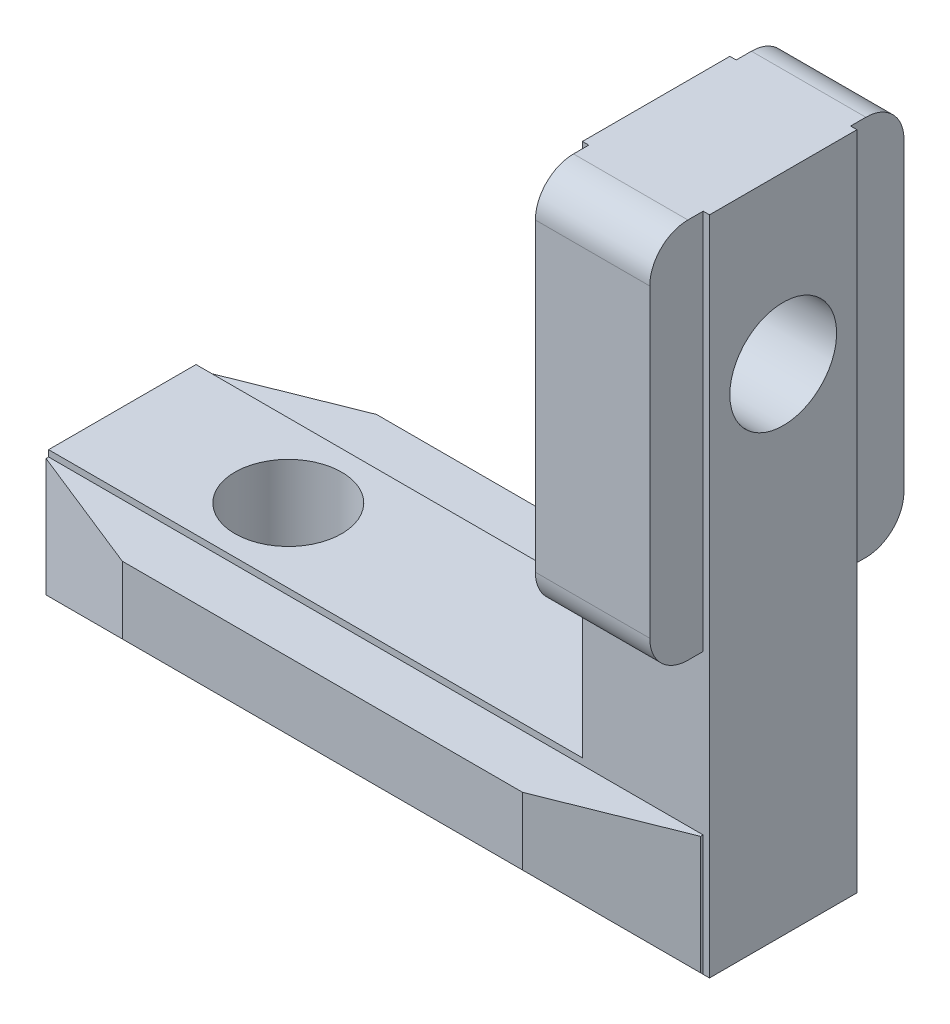
ISO-10303-21;
HEADER;
FILE_DESCRIPTION(('STEP AP214'),'2;1');
FILE_NAME('part.step','',(''),(''),'','','');
FILE_SCHEMA(('AUTOMOTIVE_DESIGN { 1 0 10303 214 1 1 1 1 }'));
ENDSEC;
DATA;
#1=APPLICATION_CONTEXT('core data for automotive mechanical design processes');
#2=APPLICATION_PROTOCOL_DEFINITION('international standard','automotive_design',2000,#1);
#3=PRODUCT_CONTEXT('',#1,'mechanical');
#4=PRODUCT('Part','Part','',(#3));
#5=PRODUCT_RELATED_PRODUCT_CATEGORY('part','',(#4));
#6=PRODUCT_DEFINITION_FORMATION('','',#4);
#7=PRODUCT_DEFINITION_CONTEXT('part definition',#1,'design');
#8=PRODUCT_DEFINITION('design','',#6,#7);
#9=PRODUCT_DEFINITION_SHAPE('','',#8);
#10=(LENGTH_UNIT() NAMED_UNIT(*) SI_UNIT(.MILLI.,.METRE.));
#11=(NAMED_UNIT(*) PLANE_ANGLE_UNIT() SI_UNIT($,.RADIAN.));
#12=(NAMED_UNIT(*) SI_UNIT($,.STERADIAN.) SOLID_ANGLE_UNIT());
#13=UNCERTAINTY_MEASURE_WITH_UNIT(LENGTH_MEASURE(1.E-05),#10,'distance_accuracy_value','');
#14=(GEOMETRIC_REPRESENTATION_CONTEXT(3) GLOBAL_UNCERTAINTY_ASSIGNED_CONTEXT((#13)) GLOBAL_UNIT_ASSIGNED_CONTEXT((#10,
#11,#12)) REPRESENTATION_CONTEXT('',''));
#15=CARTESIAN_POINT('',(0.,0.,0.));
#16=DIRECTION('',(0.,0.,1.));
#17=DIRECTION('',(1.,0.,0.));
#18=AXIS2_PLACEMENT_3D('',#15,#16,#17);
#19=CARTESIAN_POINT('',(-0.250000000000004,4.75,5.));
#20=DIRECTION('',(0.,1.,0.));
#21=DIRECTION('',(0.,0.,1.));
#22=AXIS2_PLACEMENT_3D('',#19,#20,#21);
#23=PLANE('',#22);
#24=DIRECTION('',(-1.,0.,0.));
#25=VECTOR('',#24,1.);
#26=CARTESIAN_POINT('',(-0.250000000000004,4.75,5.));
#27=LINE('',#26,#25);
#28=CARTESIAN_POINT('',(-5.25000000000005,4.75,5.));
#29=VERTEX_POINT('',#28);
#30=CARTESIAN_POINT('',(-21.,4.75,5.));
#31=VERTEX_POINT('',#30);
#32=EDGE_CURVE('E123',#29,#31,#27,.T.);
#33=ORIENTED_EDGE('',*,*,#32,.F.);
#34=DIRECTION('',(0.92847669088526,0.,-0.371390676354101));
#35=VECTOR('',#34,1.);
#36=CARTESIAN_POINT('',(-0.939655172413795,4.75,3.27586206896551));
#37=LINE('',#36,#35);
#38=CARTESIAN_POINT('',(-0.250000000000004,4.75,3.));
#39=VERTEX_POINT('',#38);
#40=EDGE_CURVE('E69',#29,#39,#37,.T.);
#41=ORIENTED_EDGE('',*,*,#40,.T.);
#42=DIRECTION('',(0.,0.,-1.));
#43=VECTOR('',#42,1.);
#44=CARTESIAN_POINT('',(-0.250000000000004,4.75,5.));
#45=LINE('',#44,#43);
#46=CARTESIAN_POINT('',(-0.250000000000004,4.75,2.9));
#47=VERTEX_POINT('',#46);
#48=EDGE_CURVE('E97',#39,#47,#45,.T.);
#49=ORIENTED_EDGE('',*,*,#48,.T.);
#50=DIRECTION('',(-1.,0.,0.));
#51=VECTOR('',#50,1.);
#52=CARTESIAN_POINT('',(-0.250000000000004,4.75,2.9));
#53=LINE('',#52,#51);
#54=CARTESIAN_POINT('',(-26.,4.75,2.9));
#55=VERTEX_POINT('',#54);
#56=EDGE_CURVE('E100',#47,#55,#53,.T.);
#57=ORIENTED_EDGE('',*,*,#56,.T.);
#58=DIRECTION('',(0.,0.,-1.));
#59=VECTOR('',#58,1.);
#60=CARTESIAN_POINT('',(-26.,4.75,5.));
#61=LINE('',#60,#59);
#62=CARTESIAN_POINT('',(-26.,4.75,2.99999999999999));
#63=VERTEX_POINT('',#62);
#64=EDGE_CURVE('E118',#63,#55,#61,.T.);
#65=ORIENTED_EDGE('',*,*,#64,.F.);
#66=DIRECTION('',(-0.928476690885261,0.,-0.371390676354101));
#67=VECTOR('',#66,1.);
#68=CARTESIAN_POINT('',(-3.1120689655172,4.75,12.155172413793));
#69=LINE('',#68,#67);
#70=EDGE_CURVE('E131',#63,#31,#69,.F.);
#71=ORIENTED_EDGE('',*,*,#70,.T.);
#72=EDGE_LOOP('',(#33,#41,#49,#57,#65,#71));
#73=FACE_BOUND('',#72,.T.);
#74=ADVANCED_FACE('F47',(#73),#23,.T.);
#75=CARTESIAN_POINT('',(-0.250000000000004,2.10000000000002,5.));
#76=DIRECTION('',(0.,0.,1.));
#77=DIRECTION('',(1.,0.,0.));
#78=AXIS2_PLACEMENT_3D('',#75,#76,#77);
#79=PLANE('',#78);
#80=DIRECTION('',(-1.,0.,0.));
#81=VECTOR('',#80,1.);
#82=CARTESIAN_POINT('',(-0.250000000000004,2.10000000000002,5.));
#83=LINE('',#82,#81);
#84=CARTESIAN_POINT('',(-5.25000000000005,2.10000000000002,5.));
#85=VERTEX_POINT('',#84);
#86=CARTESIAN_POINT('',(-21.,2.10000000000002,5.));
#87=VERTEX_POINT('',#86);
#88=EDGE_CURVE('E126',#85,#87,#83,.T.);
#89=ORIENTED_EDGE('',*,*,#88,.F.);
#90=DIRECTION('',(0.,1.,0.));
#91=VECTOR('',#90,1.);
#92=CARTESIAN_POINT('',(-5.25000000000005,4.75,5.));
#93=LINE('',#92,#91);
#94=EDGE_CURVE('E139',#85,#29,#93,.T.);
#95=ORIENTED_EDGE('',*,*,#94,.T.);
#96=ORIENTED_EDGE('',*,*,#32,.T.);
#97=DIRECTION('',(0.,-1.,0.));
#98=VECTOR('',#97,1.);
#99=CARTESIAN_POINT('',(-21.,2.10000000000002,5.));
#100=LINE('',#99,#98);
#101=EDGE_CURVE('E134',#31,#87,#100,.T.);
#102=ORIENTED_EDGE('',*,*,#101,.T.);
#103=EDGE_LOOP('',(#89,#95,#96,#102));
#104=FACE_BOUND('',#103,.T.);
#105=ADVANCED_FACE('F145',(#104),#79,.T.);
#106=CARTESIAN_POINT('',(-0.250000000000004,0.,2.9));
#107=DIRECTION('',(0.,-0.707106781186544,0.707106781186551));
#108=DIRECTION('',(0.,-0.707106781186551,-0.707106781186544));
#109=AXIS2_PLACEMENT_3D('',#106,#107,#108);
#110=PLANE('',#109);
#111=DIRECTION('',(0.,0.707106781186551,0.707106781186544));
#112=VECTOR('',#111,1.);
#113=CARTESIAN_POINT('',(-0.250000000000004,0.,2.9));
#114=LINE('',#113,#112);
#115=CARTESIAN_POINT('',(-0.250000000000004,0.,2.9));
#116=VERTEX_POINT('',#115);
#117=CARTESIAN_POINT('',(-0.250000000000004,0.0999999999999982,3.));
#118=VERTEX_POINT('',#117);
#119=EDGE_CURVE('E112',#116,#118,#114,.T.);
#120=ORIENTED_EDGE('',*,*,#119,.T.);
#121=DIRECTION('',(-0.87038827977849,0.348155311911397,0.348155311911393));
#122=VECTOR('',#121,1.);
#123=CARTESIAN_POINT('',(-0.189393939393945,0.0757575757575744,2.97575757575757));
#124=LINE('',#123,#122);
#125=EDGE_CURVE('E12',#118,#85,#124,.T.);
#126=ORIENTED_EDGE('',*,*,#125,.T.);
#127=ORIENTED_EDGE('',*,*,#88,.T.);
#128=DIRECTION('',(0.87038827977849,0.348155311911397,0.348155311911393));
#129=VECTOR('',#128,1.);
#130=CARTESIAN_POINT('',(-6.55303030303028,7.87878787878791,10.7787878787878));
#131=LINE('',#130,#129);
#132=CARTESIAN_POINT('',(-26.,0.0999999999999999,3.));
#133=VERTEX_POINT('',#132);
#134=EDGE_CURVE('E137',#87,#133,#131,.F.);
#135=ORIENTED_EDGE('',*,*,#134,.T.);
#136=DIRECTION('',(0.,0.707106781186551,0.707106781186544));
#137=VECTOR('',#136,1.);
#138=CARTESIAN_POINT('',(-26.,0.,2.9));
#139=LINE('',#138,#137);
#140=CARTESIAN_POINT('',(-26.,0.,2.9));
#141=VERTEX_POINT('',#140);
#142=EDGE_CURVE('E104',#141,#133,#139,.T.);
#143=ORIENTED_EDGE('',*,*,#142,.F.);
#144=DIRECTION('',(-1.,0.,0.));
#145=VECTOR('',#144,1.);
#146=CARTESIAN_POINT('',(-0.250000000000004,0.,2.9));
#147=LINE('',#146,#145);
#148=EDGE_CURVE('E111',#116,#141,#147,.T.);
#149=ORIENTED_EDGE('',*,*,#148,.F.);
#150=EDGE_LOOP('',(#120,#126,#127,#135,#143,#149));
#151=FACE_BOUND('',#150,.T.);
#152=ADVANCED_FACE('F155',(#151),#110,.T.);
#153=CARTESIAN_POINT('',(-0.250000000000004,4.75,2.9));
#154=DIRECTION('',(0.,0.,-1.));
#155=DIRECTION('',(0.,1.,0.));
#156=AXIS2_PLACEMENT_3D('',#153,#154,#155);
#157=PLANE('',#156);
#158=DIRECTION('',(0.,-1.,0.));
#159=VECTOR('',#158,1.);
#160=CARTESIAN_POINT('',(-26.,4.75,2.9));
#161=LINE('',#160,#159);
#162=EDGE_CURVE('E110',#55,#141,#161,.T.);
#163=ORIENTED_EDGE('',*,*,#162,.F.);
#164=ORIENTED_EDGE('',*,*,#56,.F.);
#165=DIRECTION('',(0.,-1.,0.));
#166=VECTOR('',#165,1.);
#167=CARTESIAN_POINT('',(-0.250000000000004,4.75,2.9));
#168=LINE('',#167,#166);
#169=EDGE_CURVE('E103',#47,#116,#168,.T.);
#170=ORIENTED_EDGE('',*,*,#169,.T.);
#171=ORIENTED_EDGE('',*,*,#148,.T.);
#172=EDGE_LOOP('',(#163,#164,#170,#171));
#173=FACE_BOUND('',#172,.T.);
#174=ADVANCED_FACE('F108',(#173),#157,.T.);
#175=CARTESIAN_POINT('',(-0.250000000000004,0.,0.));
#176=DIRECTION('',(-1.,0.,0.));
#177=DIRECTION('',(0.,0.,1.));
#178=AXIS2_PLACEMENT_3D('',#175,#176,#177);
#179=PLANE('',#178);
#180=ORIENTED_EDGE('',*,*,#48,.F.);
#181=DIRECTION('',(0.,-1.,0.));
#182=VECTOR('',#181,1.);
#183=CARTESIAN_POINT('',(-0.250000000000004,2.10000000000002,3.));
#184=LINE('',#183,#182);
#185=EDGE_CURVE('E55',#39,#118,#184,.T.);
#186=ORIENTED_EDGE('',*,*,#185,.T.);
#187=ORIENTED_EDGE('',*,*,#119,.F.);
#188=ORIENTED_EDGE('',*,*,#169,.F.);
#189=EDGE_LOOP('',(#180,#186,#187,#188));
#190=FACE_BOUND('',#189,.T.);
#191=ADVANCED_FACE('F114',(#190),#179,.F.);
#192=CARTESIAN_POINT('',(-26.,0.,0.));
#193=DIRECTION('',(-1.,0.,0.));
#194=DIRECTION('',(0.,0.,1.));
#195=AXIS2_PLACEMENT_3D('',#192,#193,#194);
#196=PLANE('',#195);
#197=ORIENTED_EDGE('',*,*,#142,.T.);
#198=DIRECTION('',(0.,1.,0.));
#199=VECTOR('',#198,1.);
#200=CARTESIAN_POINT('',(-26.,0.,3.));
#201=LINE('',#200,#199);
#202=EDGE_CURVE('E125',#133,#63,#201,.T.);
#203=ORIENTED_EDGE('',*,*,#202,.T.);
#204=ORIENTED_EDGE('',*,*,#64,.T.);
#205=ORIENTED_EDGE('',*,*,#162,.T.);
#206=EDGE_LOOP('',(#197,#203,#204,#205));
#207=FACE_BOUND('',#206,.T.);
#208=ADVANCED_FACE('F157',(#207),#196,.T.);
#209=CARTESIAN_POINT('',(-26.,0.,3.));
#210=DIRECTION('',(0.371390676354101,0.,-0.92847669088526));
#211=DIRECTION('',(0.,1.,0.));
#212=AXIS2_PLACEMENT_3D('',#209,#210,#211);
#213=PLANE('',#212);
#214=ORIENTED_EDGE('',*,*,#134,.F.);
#215=ORIENTED_EDGE('',*,*,#101,.F.);
#216=ORIENTED_EDGE('',*,*,#70,.F.);
#217=ORIENTED_EDGE('',*,*,#202,.F.);
#218=EDGE_LOOP('',(#214,#215,#216,#217));
#219=FACE_BOUND('',#218,.T.);
#220=ADVANCED_FACE('F152',(#219),#213,.F.);
#221=CARTESIAN_POINT('',(-5.25000000000005,2.10000000000002,5.));
#222=DIRECTION('',(0.371390676354101,0.,0.92847669088526));
#223=DIRECTION('',(0.,-1.,0.));
#224=AXIS2_PLACEMENT_3D('',#221,#222,#223);
#225=PLANE('',#224);
#226=ORIENTED_EDGE('',*,*,#125,.F.);
#227=ORIENTED_EDGE('',*,*,#185,.F.);
#228=ORIENTED_EDGE('',*,*,#40,.F.);
#229=ORIENTED_EDGE('',*,*,#94,.F.);
#230=EDGE_LOOP('',(#226,#227,#228,#229));
#231=FACE_BOUND('',#230,.T.);
#232=ADVANCED_FACE('F49',(#231),#225,.T.);
#233=CLOSED_SHELL('',(#74,#105,#152,#174,#191,#208,#220,#232));
#234=MANIFOLD_SOLID_BREP('B2',#233);
#235=CARTESIAN_POINT('',(-0.250000000000004,4.75,-2.9));
#236=DIRECTION('',(0.,0.,1.));
#237=DIRECTION('',(0.,-1.,0.));
#238=AXIS2_PLACEMENT_3D('',#235,#236,#237);
#239=PLANE('',#238);
#240=DIRECTION('',(0.,1.,0.));
#241=VECTOR('',#240,1.);
#242=CARTESIAN_POINT('',(-26.,4.75,-2.9));
#243=LINE('',#242,#241);
#244=CARTESIAN_POINT('',(-26.,0.,-2.9));
#245=VERTEX_POINT('',#244);
#246=CARTESIAN_POINT('',(-26.,4.75,-2.9));
#247=VERTEX_POINT('',#246);
#248=EDGE_CURVE('E307',#245,#247,#243,.T.);
#249=ORIENTED_EDGE('',*,*,#248,.F.);
#250=DIRECTION('',(-1.,0.,0.));
#251=VECTOR('',#250,1.);
#252=CARTESIAN_POINT('',(-0.250000000000004,0.,-2.9));
#253=LINE('',#252,#251);
#254=CARTESIAN_POINT('',(-0.250000000000004,0.,-2.9));
#255=VERTEX_POINT('',#254);
#256=EDGE_CURVE('E301',#255,#245,#253,.T.);
#257=ORIENTED_EDGE('',*,*,#256,.F.);
#258=DIRECTION('',(0.,1.,0.));
#259=VECTOR('',#258,1.);
#260=CARTESIAN_POINT('',(-0.250000000000004,4.75,-2.9));
#261=LINE('',#260,#259);
#262=CARTESIAN_POINT('',(-0.250000000000004,4.75,-2.9));
#263=VERTEX_POINT('',#262);
#264=EDGE_CURVE('E297',#255,#263,#261,.T.);
#265=ORIENTED_EDGE('',*,*,#264,.T.);
#266=DIRECTION('',(-1.,0.,0.));
#267=VECTOR('',#266,1.);
#268=CARTESIAN_POINT('',(-0.250000000000004,4.75,-2.9));
#269=LINE('',#268,#267);
#270=EDGE_CURVE('E282',#263,#247,#269,.T.);
#271=ORIENTED_EDGE('',*,*,#270,.T.);
#272=EDGE_LOOP('',(#249,#257,#265,#271));
#273=FACE_BOUND('',#272,.T.);
#274=ADVANCED_FACE('F231',(#273),#239,.T.);
#275=CARTESIAN_POINT('',(-0.250000000000004,0.,-2.9));
#276=DIRECTION('',(0.,-0.707106781186544,-0.707106781186551));
#277=DIRECTION('',(0.,0.707106781186551,-0.707106781186544));
#278=AXIS2_PLACEMENT_3D('',#275,#276,#277);
#279=PLANE('',#278);
#280=DIRECTION('',(-1.,0.,0.));
#281=VECTOR('',#280,1.);
#282=CARTESIAN_POINT('',(-0.250000000000004,2.10000000000002,-5.));
#283=LINE('',#282,#281);
#284=CARTESIAN_POINT('',(-5.25000000000005,2.10000000000002,-5.));
#285=VERTEX_POINT('',#284);
#286=CARTESIAN_POINT('',(-21.,2.10000000000002,-5.));
#287=VERTEX_POINT('',#286);
#288=EDGE_CURVE('E312',#285,#287,#283,.T.);
#289=ORIENTED_EDGE('',*,*,#288,.F.);
#290=DIRECTION('',(0.87038827977849,-0.348155311911397,0.348155311911393));
#291=VECTOR('',#290,1.);
#292=CARTESIAN_POINT('',(-0.189393939393945,0.0757575757575744,-2.97575757575757));
#293=LINE('',#292,#291);
#294=CARTESIAN_POINT('',(-0.250000000000004,0.0999999999999983,-3.));
#295=VERTEX_POINT('',#294);
#296=EDGE_CURVE('E253',#285,#295,#293,.T.);
#297=ORIENTED_EDGE('',*,*,#296,.T.);
#298=DIRECTION('',(0.,-0.707106781186551,0.707106781186544));
#299=VECTOR('',#298,1.);
#300=CARTESIAN_POINT('',(-0.250000000000004,0.,-2.9));
#301=LINE('',#300,#299);
#302=EDGE_CURVE('E293',#295,#255,#301,.T.);
#303=ORIENTED_EDGE('',*,*,#302,.T.);
#304=ORIENTED_EDGE('',*,*,#256,.T.);
#305=DIRECTION('',(0.,-0.707106781186551,0.707106781186544));
#306=VECTOR('',#305,1.);
#307=CARTESIAN_POINT('',(-26.,0.,-2.9));
#308=LINE('',#307,#306);
#309=CARTESIAN_POINT('',(-26.,0.0999999999999999,-3.));
#310=VERTEX_POINT('',#309);
#311=EDGE_CURVE('E302',#310,#245,#308,.T.);
#312=ORIENTED_EDGE('',*,*,#311,.F.);
#313=DIRECTION('',(-0.87038827977849,-0.348155311911397,0.348155311911393));
#314=VECTOR('',#313,1.);
#315=CARTESIAN_POINT('',(-6.55303030303028,7.87878787878791,-10.7787878787878));
#316=LINE('',#315,#314);
#317=EDGE_CURVE('E317',#310,#287,#316,.F.);
#318=ORIENTED_EDGE('',*,*,#317,.T.);
#319=EDGE_LOOP('',(#289,#297,#303,#304,#312,#318));
#320=FACE_BOUND('',#319,.T.);
#321=ADVANCED_FACE('F333',(#320),#279,.T.);
#322=CARTESIAN_POINT('',(-0.250000000000004,2.10000000000002,-5.));
#323=DIRECTION('',(0.,0.,-1.));
#324=DIRECTION('',(-1.,0.,0.));
#325=AXIS2_PLACEMENT_3D('',#322,#323,#324);
#326=PLANE('',#325);
#327=DIRECTION('',(-1.,0.,0.));
#328=VECTOR('',#327,1.);
#329=CARTESIAN_POINT('',(-0.250000000000004,4.75,-5.));
#330=LINE('',#329,#328);
#331=CARTESIAN_POINT('',(-5.25000000000005,4.75,-5.));
#332=VERTEX_POINT('',#331);
#333=CARTESIAN_POINT('',(-20.9999999999999,4.75,-5.));
#334=VERTEX_POINT('',#333);
#335=EDGE_CURVE('E292',#332,#334,#330,.T.);
#336=ORIENTED_EDGE('',*,*,#335,.F.);
#337=DIRECTION('',(0.,-1.,0.));
#338=VECTOR('',#337,1.);
#339=CARTESIAN_POINT('',(-5.25000000000005,2.10000000000002,-5.));
#340=LINE('',#339,#338);
#341=EDGE_CURVE('E325',#332,#285,#340,.T.);
#342=ORIENTED_EDGE('',*,*,#341,.T.);
#343=ORIENTED_EDGE('',*,*,#288,.T.);
#344=DIRECTION('',(0.,1.,0.));
#345=VECTOR('',#344,1.);
#346=CARTESIAN_POINT('',(-21.,2.10000000000002,-5.));
#347=LINE('',#346,#345);
#348=EDGE_CURVE('E320',#287,#334,#347,.T.);
#349=ORIENTED_EDGE('',*,*,#348,.T.);
#350=EDGE_LOOP('',(#336,#342,#343,#349));
#351=FACE_BOUND('',#350,.T.);
#352=ADVANCED_FACE('F331',(#351),#326,.T.);
#353=CARTESIAN_POINT('',(-0.250000000000004,4.75,-5.));
#354=DIRECTION('',(0.,1.,0.));
#355=DIRECTION('',(0.,0.,1.));
#356=AXIS2_PLACEMENT_3D('',#353,#354,#355);
#357=PLANE('',#356);
#358=DIRECTION('',(0.,0.,-1.));
#359=VECTOR('',#358,1.);
#360=CARTESIAN_POINT('',(-0.250000000000004,4.75,-5.));
#361=LINE('',#360,#359);
#362=CARTESIAN_POINT('',(-0.250000000000004,4.75,-3.));
#363=VERTEX_POINT('',#362);
#364=EDGE_CURVE('E284',#263,#363,#361,.T.);
#365=ORIENTED_EDGE('',*,*,#364,.T.);
#366=DIRECTION('',(-0.92847669088526,0.,-0.371390676354101));
#367=VECTOR('',#366,1.);
#368=CARTESIAN_POINT('',(-0.939655172413795,4.75,-3.27586206896551));
#369=LINE('',#368,#367);
#370=EDGE_CURVE('E45',#363,#332,#369,.T.);
#371=ORIENTED_EDGE('',*,*,#370,.T.);
#372=ORIENTED_EDGE('',*,*,#335,.T.);
#373=DIRECTION('',(0.928476690885261,0.,-0.371390676354101));
#374=VECTOR('',#373,1.);
#375=CARTESIAN_POINT('',(-3.1120689655172,4.75,-12.155172413793));
#376=LINE('',#375,#374);
#377=CARTESIAN_POINT('',(-26.,4.75,-2.99999999999999));
#378=VERTEX_POINT('',#377);
#379=EDGE_CURVE('E323',#334,#378,#376,.F.);
#380=ORIENTED_EDGE('',*,*,#379,.T.);
#381=DIRECTION('',(0.,0.,-1.));
#382=VECTOR('',#381,1.);
#383=CARTESIAN_POINT('',(-26.,4.75,-5.));
#384=LINE('',#383,#382);
#385=EDGE_CURVE('E287',#247,#378,#384,.T.);
#386=ORIENTED_EDGE('',*,*,#385,.F.);
#387=ORIENTED_EDGE('',*,*,#270,.F.);
#388=EDGE_LOOP('',(#365,#371,#372,#380,#386,#387));
#389=FACE_BOUND('',#388,.T.);
#390=ADVANCED_FACE('F283',(#389),#357,.T.);
#391=CARTESIAN_POINT('',(-0.250000000000004,0.,0.));
#392=DIRECTION('',(-1.,0.,0.));
#393=DIRECTION('',(0.,0.,1.));
#394=AXIS2_PLACEMENT_3D('',#391,#392,#393);
#395=PLANE('',#394);
#396=ORIENTED_EDGE('',*,*,#302,.F.);
#397=DIRECTION('',(0.,1.,0.));
#398=VECTOR('',#397,1.);
#399=CARTESIAN_POINT('',(-0.250000000000004,4.75,-3.));
#400=LINE('',#399,#398);
#401=EDGE_CURVE('E239',#295,#363,#400,.T.);
#402=ORIENTED_EDGE('',*,*,#401,.T.);
#403=ORIENTED_EDGE('',*,*,#364,.F.);
#404=ORIENTED_EDGE('',*,*,#264,.F.);
#405=EDGE_LOOP('',(#396,#402,#403,#404));
#406=FACE_BOUND('',#405,.T.);
#407=ADVANCED_FACE('F296',(#406),#395,.F.);
#408=CARTESIAN_POINT('',(-26.,0.,0.));
#409=DIRECTION('',(-1.,0.,0.));
#410=DIRECTION('',(0.,0.,1.));
#411=AXIS2_PLACEMENT_3D('',#408,#409,#410);
#412=PLANE('',#411);
#413=ORIENTED_EDGE('',*,*,#385,.T.);
#414=DIRECTION('',(0.,-1.,0.));
#415=VECTOR('',#414,1.);
#416=CARTESIAN_POINT('',(-26.,0.,-3.));
#417=LINE('',#416,#415);
#418=EDGE_CURVE('E311',#378,#310,#417,.T.);
#419=ORIENTED_EDGE('',*,*,#418,.T.);
#420=ORIENTED_EDGE('',*,*,#311,.T.);
#421=ORIENTED_EDGE('',*,*,#248,.T.);
#422=EDGE_LOOP('',(#413,#419,#420,#421));
#423=FACE_BOUND('',#422,.T.);
#424=ADVANCED_FACE('F341',(#423),#412,.T.);
#425=CARTESIAN_POINT('',(-26.,0.,-3.));
#426=DIRECTION('',(0.371390676354101,0.,0.92847669088526));
#427=DIRECTION('',(0.,-1.,0.));
#428=AXIS2_PLACEMENT_3D('',#425,#426,#427);
#429=PLANE('',#428);
#430=ORIENTED_EDGE('',*,*,#379,.F.);
#431=ORIENTED_EDGE('',*,*,#348,.F.);
#432=ORIENTED_EDGE('',*,*,#317,.F.);
#433=ORIENTED_EDGE('',*,*,#418,.F.);
#434=EDGE_LOOP('',(#430,#431,#432,#433));
#435=FACE_BOUND('',#434,.T.);
#436=ADVANCED_FACE('F339',(#435),#429,.F.);
#437=CARTESIAN_POINT('',(-5.25000000000005,2.10000000000002,-5.));
#438=DIRECTION('',(0.371390676354101,0.,-0.92847669088526));
#439=DIRECTION('',(0.,1.,0.));
#440=AXIS2_PLACEMENT_3D('',#437,#438,#439);
#441=PLANE('',#440);
#442=ORIENTED_EDGE('',*,*,#370,.F.);
#443=ORIENTED_EDGE('',*,*,#401,.F.);
#444=ORIENTED_EDGE('',*,*,#296,.F.);
#445=ORIENTED_EDGE('',*,*,#341,.F.);
#446=EDGE_LOOP('',(#442,#443,#444,#445));
#447=FACE_BOUND('',#446,.T.);
#448=ADVANCED_FACE('F233',(#447),#441,.T.);
#449=CLOSED_SHELL('',(#274,#321,#352,#390,#407,#424,#436,#448));
#450=MANIFOLD_SOLID_BREP('B6',#449);
#451=CARTESIAN_POINT('',(0.,0.,2.9));
#452=DIRECTION('',(0.,0.,1.));
#453=DIRECTION('',(1.,0.,0.));
#454=AXIS2_PLACEMENT_3D('',#451,#452,#453);
#455=PLANE('',#454);
#456=DIRECTION('',(-1.,0.,0.));
#457=VECTOR('',#456,1.);
#458=CARTESIAN_POINT('',(-5.,26.,2.9));
#459=LINE('',#458,#457);
#460=CARTESIAN_POINT('',(0.,26.,2.9));
#461=VERTEX_POINT('',#460);
#462=CARTESIAN_POINT('',(-0.25,26.,2.9));
#463=VERTEX_POINT('',#462);
#464=EDGE_CURVE('E585',#461,#463,#459,.T.);
#465=ORIENTED_EDGE('',*,*,#464,.T.);
#466=DIRECTION('',(0.,-1.,0.));
#467=VECTOR('',#466,1.);
#468=CARTESIAN_POINT('',(-0.25,26.,2.9));
#469=LINE('',#468,#467);
#470=CARTESIAN_POINT('',(-0.25,11.,2.9));
#471=VERTEX_POINT('',#470);
#472=EDGE_CURVE('E411',#463,#471,#469,.T.);
#473=ORIENTED_EDGE('',*,*,#472,.T.);
#474=DIRECTION('',(1.,0.,0.));
#475=VECTOR('',#474,1.);
#476=CARTESIAN_POINT('',(-4.75,11.,2.9));
#477=LINE('',#476,#475);
#478=CARTESIAN_POINT('',(-4.75,11.,2.9));
#479=VERTEX_POINT('',#478);
#480=EDGE_CURVE('E722',#479,#471,#477,.T.);
#481=ORIENTED_EDGE('',*,*,#480,.F.);
#482=DIRECTION('',(0.,-1.,0.));
#483=VECTOR('',#482,1.);
#484=CARTESIAN_POINT('',(-4.75,26.,2.9));
#485=LINE('',#484,#483);
#486=CARTESIAN_POINT('',(-4.75,26.,2.9));
#487=VERTEX_POINT('',#486);
#488=EDGE_CURVE('E430',#487,#479,#485,.T.);
#489=ORIENTED_EDGE('',*,*,#488,.F.);
#490=CARTESIAN_POINT('',(-5.,26.,2.9));
#491=VERTEX_POINT('',#490);
#492=EDGE_CURVE('E589',#487,#491,#459,.T.);
#493=ORIENTED_EDGE('',*,*,#492,.T.);
#494=DIRECTION('',(0.,-1.,0.));
#495=VECTOR('',#494,1.);
#496=CARTESIAN_POINT('',(-5.,5.,2.9));
#497=LINE('',#496,#495);
#498=CARTESIAN_POINT('',(-5.,5.,2.9));
#499=VERTEX_POINT('',#498);
#500=EDGE_CURVE('E588',#491,#499,#497,.T.);
#501=ORIENTED_EDGE('',*,*,#500,.T.);
#502=DIRECTION('',(-1.,0.,0.));
#503=VECTOR('',#502,1.);
#504=CARTESIAN_POINT('',(-26.,5.,2.9));
#505=LINE('',#504,#503);
#506=CARTESIAN_POINT('',(-26.,5.,2.9));
#507=VERTEX_POINT('',#506);
#508=EDGE_CURVE('E598',#499,#507,#505,.T.);
#509=ORIENTED_EDGE('',*,*,#508,.T.);
#510=DIRECTION('',(0.,-1.,0.));
#511=VECTOR('',#510,1.);
#512=CARTESIAN_POINT('',(-26.,5.,2.9));
#513=LINE('',#512,#511);
#514=CARTESIAN_POINT('',(-26.,0.,2.9));
#515=VERTEX_POINT('',#514);
#516=EDGE_CURVE('E634',#507,#515,#513,.T.);
#517=ORIENTED_EDGE('',*,*,#516,.T.);
#518=DIRECTION('',(1.,0.,0.));
#519=VECTOR('',#518,1.);
#520=CARTESIAN_POINT('',(-26.,0.,2.9));
#521=LINE('',#520,#519);
#522=CARTESIAN_POINT('',(0.,0.,2.9));
#523=VERTEX_POINT('',#522);
#524=EDGE_CURVE('E639',#515,#523,#521,.T.);
#525=ORIENTED_EDGE('',*,*,#524,.T.);
#526=DIRECTION('',(0.,1.,0.));
#527=VECTOR('',#526,1.);
#528=CARTESIAN_POINT('',(0.,0.,2.9));
#529=LINE('',#528,#527);
#530=EDGE_CURVE('E594',#523,#461,#529,.T.);
#531=ORIENTED_EDGE('',*,*,#530,.T.);
#532=EDGE_LOOP('',(#465,#473,#481,#489,#493,#501,#509,#517,#525,#531));
#533=FACE_BOUND('',#532,.T.);
#534=ADVANCED_FACE('F407',(#533),#455,.T.);
#535=CARTESIAN_POINT('',(-26.,5.,2.9));
#536=DIRECTION('',(1.,0.,0.));
#537=DIRECTION('',(0.,0.,-1.));
#538=AXIS2_PLACEMENT_3D('',#535,#536,#537);
#539=PLANE('',#538);
#540=DIRECTION('',(0.,-1.,0.));
#541=VECTOR('',#540,1.);
#542=CARTESIAN_POINT('',(-26.,5.,-2.9));
#543=LINE('',#542,#541);
#544=CARTESIAN_POINT('',(-26.,5.,-2.9));
#545=VERTEX_POINT('',#544);
#546=CARTESIAN_POINT('',(-26.,0.,-2.9));
#547=VERTEX_POINT('',#546);
#548=EDGE_CURVE('E601',#545,#547,#543,.T.);
#549=ORIENTED_EDGE('',*,*,#548,.T.);
#550=DIRECTION('',(0.,0.,-1.));
#551=VECTOR('',#550,1.);
#552=CARTESIAN_POINT('',(-26.,0.,2.9));
#553=LINE('',#552,#551);
#554=EDGE_CURVE('E229',#515,#547,#553,.T.);
#555=ORIENTED_EDGE('',*,*,#554,.F.);
#556=ORIENTED_EDGE('',*,*,#516,.F.);
#557=DIRECTION('',(0.,0.,-1.));
#558=VECTOR('',#557,1.);
#559=CARTESIAN_POINT('',(-26.,5.,2.9));
#560=LINE('',#559,#558);
#561=EDGE_CURVE('E600',#507,#545,#560,.T.);
#562=ORIENTED_EDGE('',*,*,#561,.T.);
#563=EDGE_LOOP('',(#549,#555,#556,#562));
#564=FACE_BOUND('',#563,.T.);
#565=ADVANCED_FACE('F409',(#564),#539,.F.);
#566=CARTESIAN_POINT('',(-26.,0.,2.9));
#567=DIRECTION('',(0.,1.,0.));
#568=DIRECTION('',(0.,0.,1.));
#569=AXIS2_PLACEMENT_3D('',#566,#567,#568);
#570=PLANE('',#569);
#571=CARTESIAN_POINT('',(-19.47,0.,0.));
#572=DIRECTION('',(0.,1.,0.));
#573=DIRECTION('',(0.,0.,1.));
#574=AXIS2_PLACEMENT_3D('',#571,#572,#573);
#575=CIRCLE('',#574,2.1);
#576=CARTESIAN_POINT('',(-19.47,0.,2.1));
#577=VERTEX_POINT('',#576);
#578=EDGE_CURVE('E736',#577,#577,#575,.T.);
#579=ORIENTED_EDGE('',*,*,#578,.T.);
#580=EDGE_LOOP('',(#579));
#581=FACE_BOUND('',#580,.T.);
#582=DIRECTION('',(1.,0.,0.));
#583=VECTOR('',#582,1.);
#584=CARTESIAN_POINT('',(-26.,0.,-2.9));
#585=LINE('',#584,#583);
#586=CARTESIAN_POINT('',(0.,0.,-2.9));
#587=VERTEX_POINT('',#586);
#588=EDGE_CURVE('E604',#547,#587,#585,.T.);
#589=ORIENTED_EDGE('',*,*,#588,.T.);
#590=DIRECTION('',(0.,0.,-1.));
#591=VECTOR('',#590,1.);
#592=CARTESIAN_POINT('',(0.,0.,2.9));
#593=LINE('',#592,#591);
#594=EDGE_CURVE('E417',#523,#587,#593,.T.);
#595=ORIENTED_EDGE('',*,*,#594,.F.);
#596=ORIENTED_EDGE('',*,*,#524,.F.);
#597=ORIENTED_EDGE('',*,*,#554,.T.);
#598=EDGE_LOOP('',(#589,#595,#596,#597));
#599=FACE_BOUND('',#598,.T.);
#600=ADVANCED_FACE('F752',(#581,#599),#570,.F.);
#601=CARTESIAN_POINT('',(0.,0.,2.9));
#602=DIRECTION('',(-1.,0.,0.));
#603=DIRECTION('',(0.,0.,1.));
#604=AXIS2_PLACEMENT_3D('',#601,#602,#603);
#605=PLANE('',#604);
#606=CARTESIAN_POINT('',(0.,19.47,0.));
#607=DIRECTION('',(-1.,0.,0.));
#608=DIRECTION('',(0.,0.,1.));
#609=AXIS2_PLACEMENT_3D('',#606,#607,#608);
#610=CIRCLE('',#609,2.1);
#611=CARTESIAN_POINT('',(0.,19.47,2.1));
#612=VERTEX_POINT('',#611);
#613=EDGE_CURVE('E900',#612,#612,#610,.T.);
#614=ORIENTED_EDGE('',*,*,#613,.T.);
#615=EDGE_LOOP('',(#614));
#616=FACE_BOUND('',#615,.T.);
#617=DIRECTION('',(0.,1.,0.));
#618=VECTOR('',#617,1.);
#619=CARTESIAN_POINT('',(0.,0.,-2.9));
#620=LINE('',#619,#618);
#621=CARTESIAN_POINT('',(0.,26.,-2.9));
#622=VERTEX_POINT('',#621);
#623=EDGE_CURVE('E607',#587,#622,#620,.T.);
#624=ORIENTED_EDGE('',*,*,#623,.T.);
#625=DIRECTION('',(0.,0.,-1.));
#626=VECTOR('',#625,1.);
#627=CARTESIAN_POINT('',(0.,26.,2.9));
#628=LINE('',#627,#626);
#629=EDGE_CURVE('E623',#461,#622,#628,.T.);
#630=ORIENTED_EDGE('',*,*,#629,.F.);
#631=ORIENTED_EDGE('',*,*,#530,.F.);
#632=ORIENTED_EDGE('',*,*,#594,.T.);
#633=EDGE_LOOP('',(#624,#630,#631,#632));
#634=FACE_BOUND('',#633,.T.);
#635=ADVANCED_FACE('F703',(#616,#634),#605,.F.);
#636=CARTESIAN_POINT('',(-5.,26.,2.9));
#637=DIRECTION('',(0.,-1.,0.));
#638=DIRECTION('',(0.,0.,-1.));
#639=AXIS2_PLACEMENT_3D('',#636,#637,#638);
#640=PLANE('',#639);
#641=DIRECTION('',(-1.,0.,0.));
#642=VECTOR('',#641,1.);
#643=CARTESIAN_POINT('',(-5.,26.,-2.9));
#644=LINE('',#643,#642);
#645=CARTESIAN_POINT('',(-0.25,26.,-2.9));
#646=VERTEX_POINT('',#645);
#647=EDGE_CURVE('E618',#622,#646,#644,.T.);
#648=ORIENTED_EDGE('',*,*,#647,.T.);
#649=DIRECTION('',(0.,0.,-1.));
#650=VECTOR('',#649,1.);
#651=CARTESIAN_POINT('',(-0.25,26.,-3.49999999999999));
#652=LINE('',#651,#650);
#653=CARTESIAN_POINT('',(-0.25,26.,-3.49999999999999));
#654=VERTEX_POINT('',#653);
#655=EDGE_CURVE('E561',#646,#654,#652,.T.);
#656=ORIENTED_EDGE('',*,*,#655,.T.);
#657=DIRECTION('',(1.,0.,0.));
#658=VECTOR('',#657,1.);
#659=CARTESIAN_POINT('',(-4.75,26.,-3.49999999999999));
#660=LINE('',#659,#658);
#661=CARTESIAN_POINT('',(-4.75,26.,-3.49999999999999));
#662=VERTEX_POINT('',#661);
#663=EDGE_CURVE('E605',#662,#654,#660,.T.);
#664=ORIENTED_EDGE('',*,*,#663,.F.);
#665=DIRECTION('',(0.,0.,-1.));
#666=VECTOR('',#665,1.);
#667=CARTESIAN_POINT('',(-4.75,26.,-3.49999999999999));
#668=LINE('',#667,#666);
#669=CARTESIAN_POINT('',(-4.75,26.,-2.9));
#670=VERTEX_POINT('',#669);
#671=EDGE_CURVE('E570',#670,#662,#668,.T.);
#672=ORIENTED_EDGE('',*,*,#671,.F.);
#673=CARTESIAN_POINT('',(-5.,26.,-2.9));
#674=VERTEX_POINT('',#673);
#675=EDGE_CURVE('E609',#670,#674,#644,.T.);
#676=ORIENTED_EDGE('',*,*,#675,.T.);
#677=DIRECTION('',(0.,0.,-1.));
#678=VECTOR('',#677,1.);
#679=CARTESIAN_POINT('',(-5.,26.,2.9));
#680=LINE('',#679,#678);
#681=EDGE_CURVE('E626',#491,#674,#680,.T.);
#682=ORIENTED_EDGE('',*,*,#681,.F.);
#683=ORIENTED_EDGE('',*,*,#492,.F.);
#684=DIRECTION('',(0.,0.,-1.));
#685=VECTOR('',#684,1.);
#686=CARTESIAN_POINT('',(-4.75,26.,3.49999999999999));
#687=LINE('',#686,#685);
#688=CARTESIAN_POINT('',(-4.75,26.,3.49999999999999));
#689=VERTEX_POINT('',#688);
#690=EDGE_CURVE('E724',#689,#487,#687,.T.);
#691=ORIENTED_EDGE('',*,*,#690,.F.);
#692=DIRECTION('',(1.,0.,0.));
#693=VECTOR('',#692,1.);
#694=CARTESIAN_POINT('',(-4.75,26.,3.49999999999999));
#695=LINE('',#694,#693);
#696=CARTESIAN_POINT('',(-0.25,26.,3.49999999999999));
#697=VERTEX_POINT('',#696);
#698=EDGE_CURVE('E563',#689,#697,#695,.T.);
#699=ORIENTED_EDGE('',*,*,#698,.T.);
#700=DIRECTION('',(0.,0.,-1.));
#701=VECTOR('',#700,1.);
#702=CARTESIAN_POINT('',(-0.25,26.,3.49999999999999));
#703=LINE('',#702,#701);
#704=EDGE_CURVE('E707',#697,#463,#703,.T.);
#705=ORIENTED_EDGE('',*,*,#704,.T.);
#706=ORIENTED_EDGE('',*,*,#464,.F.);
#707=ORIENTED_EDGE('',*,*,#629,.T.);
#708=EDGE_LOOP('',(#648,#656,#664,#672,#676,#682,#683,#691,#699,#705,#706,#707));
#709=FACE_BOUND('',#708,.T.);
#710=ADVANCED_FACE('F662',(#709),#640,.F.);
#711=CARTESIAN_POINT('',(-5.,5.,2.9));
#712=DIRECTION('',(1.,0.,0.));
#713=DIRECTION('',(0.,0.,-1.));
#714=AXIS2_PLACEMENT_3D('',#711,#712,#713);
#715=PLANE('',#714);
#716=CARTESIAN_POINT('',(-4.99999999999999,19.47,0.));
#717=DIRECTION('',(-1.,0.,0.));
#718=DIRECTION('',(0.,0.,1.));
#719=AXIS2_PLACEMENT_3D('',#716,#717,#718);
#720=CIRCLE('',#719,2.1);
#721=CARTESIAN_POINT('',(-4.99999999999999,19.47,2.1));
#722=VERTEX_POINT('',#721);
#723=EDGE_CURVE('E897',#722,#722,#720,.T.);
#724=ORIENTED_EDGE('',*,*,#723,.F.);
#725=EDGE_LOOP('',(#724));
#726=FACE_BOUND('',#725,.T.);
#727=DIRECTION('',(0.,-1.,0.));
#728=VECTOR('',#727,1.);
#729=CARTESIAN_POINT('',(-5.,5.,-2.9));
#730=LINE('',#729,#728);
#731=CARTESIAN_POINT('',(-5.,5.,-2.9));
#732=VERTEX_POINT('',#731);
#733=EDGE_CURVE('E612',#674,#732,#730,.T.);
#734=ORIENTED_EDGE('',*,*,#733,.T.);
#735=DIRECTION('',(0.,0.,-1.));
#736=VECTOR('',#735,1.);
#737=CARTESIAN_POINT('',(-5.,5.,2.9));
#738=LINE('',#737,#736);
#739=EDGE_CURVE('E629',#499,#732,#738,.T.);
#740=ORIENTED_EDGE('',*,*,#739,.F.);
#741=ORIENTED_EDGE('',*,*,#500,.F.);
#742=ORIENTED_EDGE('',*,*,#681,.T.);
#743=EDGE_LOOP('',(#734,#740,#741,#742));
#744=FACE_BOUND('',#743,.T.);
#745=ADVANCED_FACE('F644',(#726,#744),#715,.F.);
#746=CARTESIAN_POINT('',(-26.,5.,2.9));
#747=DIRECTION('',(0.,-1.,0.));
#748=DIRECTION('',(0.,0.,-1.));
#749=AXIS2_PLACEMENT_3D('',#746,#747,#748);
#750=PLANE('',#749);
#751=CARTESIAN_POINT('',(-19.47,5.,0.));
#752=DIRECTION('',(0.,1.,0.));
#753=DIRECTION('',(0.,0.,1.));
#754=AXIS2_PLACEMENT_3D('',#751,#752,#753);
#755=CIRCLE('',#754,2.1);
#756=CARTESIAN_POINT('',(-19.47,5.,2.1));
#757=VERTEX_POINT('',#756);
#758=EDGE_CURVE('E901',#757,#757,#755,.T.);
#759=ORIENTED_EDGE('',*,*,#758,.F.);
#760=EDGE_LOOP('',(#759));
#761=FACE_BOUND('',#760,.T.);
#762=DIRECTION('',(-1.,0.,0.));
#763=VECTOR('',#762,1.);
#764=CARTESIAN_POINT('',(-26.,5.,-2.9));
#765=LINE('',#764,#763);
#766=EDGE_CURVE('E633',#732,#545,#765,.T.);
#767=ORIENTED_EDGE('',*,*,#766,.T.);
#768=ORIENTED_EDGE('',*,*,#561,.F.);
#769=ORIENTED_EDGE('',*,*,#508,.F.);
#770=ORIENTED_EDGE('',*,*,#739,.T.);
#771=EDGE_LOOP('',(#767,#768,#769,#770));
#772=FACE_BOUND('',#771,.T.);
#773=ADVANCED_FACE('F650',(#761,#772),#750,.F.);
#774=CARTESIAN_POINT('',(0.,0.,-2.9));
#775=DIRECTION('',(0.,0.,1.));
#776=DIRECTION('',(1.,0.,0.));
#777=AXIS2_PLACEMENT_3D('',#774,#775,#776);
#778=PLANE('',#777);
#779=DIRECTION('',(1.,0.,0.));
#780=VECTOR('',#779,1.);
#781=CARTESIAN_POINT('',(-4.75,11.,-2.9));
#782=LINE('',#781,#780);
#783=CARTESIAN_POINT('',(-4.75,11.,-2.9));
#784=VERTEX_POINT('',#783);
#785=CARTESIAN_POINT('',(-0.25,11.,-2.9));
#786=VERTEX_POINT('',#785);
#787=EDGE_CURVE('E576',#784,#786,#782,.T.);
#788=ORIENTED_EDGE('',*,*,#787,.T.);
#789=DIRECTION('',(0.,1.,0.));
#790=VECTOR('',#789,1.);
#791=CARTESIAN_POINT('',(-0.25,26.,-2.9));
#792=LINE('',#791,#790);
#793=EDGE_CURVE('E558',#786,#646,#792,.T.);
#794=ORIENTED_EDGE('',*,*,#793,.T.);
#795=ORIENTED_EDGE('',*,*,#647,.F.);
#796=ORIENTED_EDGE('',*,*,#623,.F.);
#797=ORIENTED_EDGE('',*,*,#588,.F.);
#798=ORIENTED_EDGE('',*,*,#548,.F.);
#799=ORIENTED_EDGE('',*,*,#766,.F.);
#800=ORIENTED_EDGE('',*,*,#733,.F.);
#801=ORIENTED_EDGE('',*,*,#675,.F.);
#802=DIRECTION('',(0.,1.,0.));
#803=VECTOR('',#802,1.);
#804=CARTESIAN_POINT('',(-4.75,26.,-2.9));
#805=LINE('',#804,#803);
#806=EDGE_CURVE('E666',#784,#670,#805,.T.);
#807=ORIENTED_EDGE('',*,*,#806,.F.);
#808=EDGE_LOOP('',(#788,#794,#795,#796,#797,#798,#799,#800,#801,#807));
#809=FACE_BOUND('',#808,.T.);
#810=ADVANCED_FACE('F653',(#809),#778,.F.);
#811=CARTESIAN_POINT('',(-4.75,24.5,-3.5));
#812=DIRECTION('',(1.,0.,0.));
#813=DIRECTION('',(0.,0.,-1.));
#814=AXIS2_PLACEMENT_3D('',#811,#812,#813);
#815=CYLINDRICAL_SURFACE('',#814,1.5);
#816=CARTESIAN_POINT('',(-0.25,24.5,-3.5));
#817=DIRECTION('',(-1.,0.,0.));
#818=DIRECTION('',(0.,0.,-1.));
#819=AXIS2_PLACEMENT_3D('',#816,#817,#818);
#820=CIRCLE('',#819,1.5);
#821=CARTESIAN_POINT('',(-0.25,24.5,-5.));
#822=VERTEX_POINT('',#821);
#823=EDGE_CURVE('E579',#654,#822,#820,.T.);
#824=ORIENTED_EDGE('',*,*,#823,.T.);
#825=DIRECTION('',(1.,0.,0.));
#826=VECTOR('',#825,1.);
#827=CARTESIAN_POINT('',(-4.75,24.5,-5.));
#828=LINE('',#827,#826);
#829=CARTESIAN_POINT('',(-4.75,24.5,-5.));
#830=VERTEX_POINT('',#829);
#831=EDGE_CURVE('E696',#830,#822,#828,.T.);
#832=ORIENTED_EDGE('',*,*,#831,.F.);
#833=CARTESIAN_POINT('',(-4.75,24.5,-3.5));
#834=DIRECTION('',(-1.,0.,0.));
#835=DIRECTION('',(0.,0.,-1.));
#836=AXIS2_PLACEMENT_3D('',#833,#834,#835);
#837=CIRCLE('',#836,1.5);
#838=EDGE_CURVE('E567',#662,#830,#837,.T.);
#839=ORIENTED_EDGE('',*,*,#838,.F.);
#840=ORIENTED_EDGE('',*,*,#663,.T.);
#841=EDGE_LOOP('',(#824,#832,#839,#840));
#842=FACE_BOUND('',#841,.T.);
#843=ADVANCED_FACE('F755',(#842),#815,.T.);
#844=CARTESIAN_POINT('',(-4.75,12.5,-5.));
#845=DIRECTION('',(0.,0.,1.));
#846=DIRECTION('',(1.,0.,0.));
#847=AXIS2_PLACEMENT_3D('',#844,#845,#846);
#848=PLANE('',#847);
#849=DIRECTION('',(0.,-1.,0.));
#850=VECTOR('',#849,1.);
#851=CARTESIAN_POINT('',(-0.25,12.5,-5.));
#852=LINE('',#851,#850);
#853=CARTESIAN_POINT('',(-0.25,12.5,-5.));
#854=VERTEX_POINT('',#853);
#855=EDGE_CURVE('E679',#822,#854,#852,.T.);
#856=ORIENTED_EDGE('',*,*,#855,.T.);
#857=DIRECTION('',(1.,0.,0.));
#858=VECTOR('',#857,1.);
#859=CARTESIAN_POINT('',(-4.75,12.5,-5.));
#860=LINE('',#859,#858);
#861=CARTESIAN_POINT('',(-4.75,12.5,-5.));
#862=VERTEX_POINT('',#861);
#863=EDGE_CURVE('E694',#862,#854,#860,.T.);
#864=ORIENTED_EDGE('',*,*,#863,.F.);
#865=DIRECTION('',(0.,-1.,0.));
#866=VECTOR('',#865,1.);
#867=CARTESIAN_POINT('',(-4.75,12.5,-5.));
#868=LINE('',#867,#866);
#869=EDGE_CURVE('E569',#830,#862,#868,.T.);
#870=ORIENTED_EDGE('',*,*,#869,.F.);
#871=ORIENTED_EDGE('',*,*,#831,.T.);
#872=EDGE_LOOP('',(#856,#864,#870,#871));
#873=FACE_BOUND('',#872,.T.);
#874=ADVANCED_FACE('F788',(#873),#848,.F.);
#875=CARTESIAN_POINT('',(-4.75,12.5,-3.5));
#876=DIRECTION('',(1.,0.,0.));
#877=DIRECTION('',(0.,0.,-1.));
#878=AXIS2_PLACEMENT_3D('',#875,#876,#877);
#879=CYLINDRICAL_SURFACE('',#878,1.5);
#880=CARTESIAN_POINT('',(-0.25,12.5,-3.5));
#881=DIRECTION('',(-1.,0.,0.));
#882=DIRECTION('',(0.,0.,-1.));
#883=AXIS2_PLACEMENT_3D('',#880,#881,#882);
#884=CIRCLE('',#883,1.5);
#885=CARTESIAN_POINT('',(-0.25,11.,-3.49999999999999));
#886=VERTEX_POINT('',#885);
#887=EDGE_CURVE('E672',#854,#886,#884,.T.);
#888=ORIENTED_EDGE('',*,*,#887,.T.);
#889=DIRECTION('',(1.,0.,0.));
#890=VECTOR('',#889,1.);
#891=CARTESIAN_POINT('',(-4.75,11.,-3.49999999999999));
#892=LINE('',#891,#890);
#893=CARTESIAN_POINT('',(-4.75,11.,-3.49999999999999));
#894=VERTEX_POINT('',#893);
#895=EDGE_CURVE('E691',#894,#886,#892,.T.);
#896=ORIENTED_EDGE('',*,*,#895,.F.);
#897=CARTESIAN_POINT('',(-4.75,12.5,-3.5));
#898=DIRECTION('',(-1.,0.,0.));
#899=DIRECTION('',(0.,0.,-1.));
#900=AXIS2_PLACEMENT_3D('',#897,#898,#899);
#901=CIRCLE('',#900,1.5);
#902=EDGE_CURVE('E572',#862,#894,#901,.T.);
#903=ORIENTED_EDGE('',*,*,#902,.F.);
#904=ORIENTED_EDGE('',*,*,#863,.T.);
#905=EDGE_LOOP('',(#888,#896,#903,#904));
#906=FACE_BOUND('',#905,.T.);
#907=ADVANCED_FACE('F786',(#906),#879,.T.);
#908=CARTESIAN_POINT('',(-4.75,11.,-2.9));
#909=DIRECTION('',(0.,1.,0.));
#910=DIRECTION('',(0.,0.,1.));
#911=AXIS2_PLACEMENT_3D('',#908,#909,#910);
#912=PLANE('',#911);
#913=DIRECTION('',(0.,0.,1.));
#914=VECTOR('',#913,1.);
#915=CARTESIAN_POINT('',(-0.25,11.,-2.9));
#916=LINE('',#915,#914);
#917=EDGE_CURVE('E669',#886,#786,#916,.T.);
#918=ORIENTED_EDGE('',*,*,#917,.T.);
#919=ORIENTED_EDGE('',*,*,#787,.F.);
#920=DIRECTION('',(0.,0.,1.));
#921=VECTOR('',#920,1.);
#922=CARTESIAN_POINT('',(-4.75,11.,-2.9));
#923=LINE('',#922,#921);
#924=EDGE_CURVE('E574',#894,#784,#923,.T.);
#925=ORIENTED_EDGE('',*,*,#924,.F.);
#926=ORIENTED_EDGE('',*,*,#895,.T.);
#927=EDGE_LOOP('',(#918,#919,#925,#926));
#928=FACE_BOUND('',#927,.T.);
#929=ADVANCED_FACE('F781',(#928),#912,.F.);
#930=CARTESIAN_POINT('',(-4.75,12.5,-3.5));
#931=DIRECTION('',(1.,0.,0.));
#932=DIRECTION('',(0.,0.,-1.));
#933=AXIS2_PLACEMENT_3D('',#930,#931,#932);
#934=PLANE('',#933);
#935=ORIENTED_EDGE('',*,*,#806,.T.);
#936=ORIENTED_EDGE('',*,*,#671,.T.);
#937=ORIENTED_EDGE('',*,*,#838,.T.);
#938=ORIENTED_EDGE('',*,*,#869,.T.);
#939=ORIENTED_EDGE('',*,*,#902,.T.);
#940=ORIENTED_EDGE('',*,*,#924,.T.);
#941=EDGE_LOOP('',(#935,#936,#937,#938,#939,#940));
#942=FACE_BOUND('',#941,.T.);
#943=ADVANCED_FACE('F789',(#942),#934,.F.);
#944=CARTESIAN_POINT('',(-0.25,12.5,-3.5));
#945=DIRECTION('',(1.,0.,0.));
#946=DIRECTION('',(0.,0.,-1.));
#947=AXIS2_PLACEMENT_3D('',#944,#945,#946);
#948=PLANE('',#947);
#949=ORIENTED_EDGE('',*,*,#793,.F.);
#950=ORIENTED_EDGE('',*,*,#917,.F.);
#951=ORIENTED_EDGE('',*,*,#887,.F.);
#952=ORIENTED_EDGE('',*,*,#855,.F.);
#953=ORIENTED_EDGE('',*,*,#823,.F.);
#954=ORIENTED_EDGE('',*,*,#655,.F.);
#955=EDGE_LOOP('',(#949,#950,#951,#952,#953,#954));
#956=FACE_BOUND('',#955,.T.);
#957=ADVANCED_FACE('F778',(#956),#948,.T.);
#958=CARTESIAN_POINT('',(-4.75,12.5,3.5));
#959=DIRECTION('',(1.,0.,0.));
#960=DIRECTION('',(0.,0.,-1.));
#961=AXIS2_PLACEMENT_3D('',#958,#959,#960);
#962=CYLINDRICAL_SURFACE('',#961,1.5);
#963=CARTESIAN_POINT('',(-0.25,12.5,3.5));
#964=DIRECTION('',(-1.,0.,0.));
#965=DIRECTION('',(0.,0.,1.));
#966=AXIS2_PLACEMENT_3D('',#963,#964,#965);
#967=CIRCLE('',#966,1.5);
#968=CARTESIAN_POINT('',(-0.25,11.,3.49999999999999));
#969=VERTEX_POINT('',#968);
#970=CARTESIAN_POINT('',(-0.25,12.5,5.));
#971=VERTEX_POINT('',#970);
#972=EDGE_CURVE('E557',#969,#971,#967,.T.);
#973=ORIENTED_EDGE('',*,*,#972,.T.);
#974=DIRECTION('',(1.,0.,0.));
#975=VECTOR('',#974,1.);
#976=CARTESIAN_POINT('',(-4.75,12.5,5.));
#977=LINE('',#976,#975);
#978=CARTESIAN_POINT('',(-4.75,12.5,5.));
#979=VERTEX_POINT('',#978);
#980=EDGE_CURVE('E537',#979,#971,#977,.T.);
#981=ORIENTED_EDGE('',*,*,#980,.F.);
#982=CARTESIAN_POINT('',(-4.75,12.5,3.5));
#983=DIRECTION('',(-1.,0.,0.));
#984=DIRECTION('',(0.,0.,1.));
#985=AXIS2_PLACEMENT_3D('',#982,#983,#984);
#986=CIRCLE('',#985,1.5);
#987=CARTESIAN_POINT('',(-4.75,11.,3.49999999999999));
#988=VERTEX_POINT('',#987);
#989=EDGE_CURVE('E544',#988,#979,#986,.T.);
#990=ORIENTED_EDGE('',*,*,#989,.F.);
#991=DIRECTION('',(1.,0.,0.));
#992=VECTOR('',#991,1.);
#993=CARTESIAN_POINT('',(-4.75,11.,3.49999999999999));
#994=LINE('',#993,#992);
#995=EDGE_CURVE('E720',#988,#969,#994,.T.);
#996=ORIENTED_EDGE('',*,*,#995,.T.);
#997=EDGE_LOOP('',(#973,#981,#990,#996));
#998=FACE_BOUND('',#997,.T.);
#999=ADVANCED_FACE('F555',(#998),#962,.T.);
#1000=CARTESIAN_POINT('',(-4.75,12.5,5.));
#1001=DIRECTION('',(0.,0.,-1.));
#1002=DIRECTION('',(-1.,0.,0.));
#1003=AXIS2_PLACEMENT_3D('',#1000,#1001,#1002);
#1004=PLANE('',#1003);
#1005=DIRECTION('',(0.,1.,0.));
#1006=VECTOR('',#1005,1.);
#1007=CARTESIAN_POINT('',(-0.25,12.5,5.));
#1008=LINE('',#1007,#1006);
#1009=CARTESIAN_POINT('',(-0.25,24.5,5.));
#1010=VERTEX_POINT('',#1009);
#1011=EDGE_CURVE('E735',#971,#1010,#1008,.T.);
#1012=ORIENTED_EDGE('',*,*,#1011,.T.);
#1013=DIRECTION('',(1.,0.,0.));
#1014=VECTOR('',#1013,1.);
#1015=CARTESIAN_POINT('',(-4.75,24.5,5.));
#1016=LINE('',#1015,#1014);
#1017=CARTESIAN_POINT('',(-4.75,24.5,5.));
#1018=VERTEX_POINT('',#1017);
#1019=EDGE_CURVE('E540',#1018,#1010,#1016,.T.);
#1020=ORIENTED_EDGE('',*,*,#1019,.F.);
#1021=DIRECTION('',(0.,1.,0.));
#1022=VECTOR('',#1021,1.);
#1023=CARTESIAN_POINT('',(-4.75,12.5,5.));
#1024=LINE('',#1023,#1022);
#1025=EDGE_CURVE('E533',#979,#1018,#1024,.T.);
#1026=ORIENTED_EDGE('',*,*,#1025,.F.);
#1027=ORIENTED_EDGE('',*,*,#980,.T.);
#1028=EDGE_LOOP('',(#1012,#1020,#1026,#1027));
#1029=FACE_BOUND('',#1028,.T.);
#1030=ADVANCED_FACE('F535',(#1029),#1004,.F.);
#1031=CARTESIAN_POINT('',(-4.75,24.5,3.5));
#1032=DIRECTION('',(1.,0.,0.));
#1033=DIRECTION('',(0.,0.,-1.));
#1034=AXIS2_PLACEMENT_3D('',#1031,#1032,#1033);
#1035=CYLINDRICAL_SURFACE('',#1034,1.5);
#1036=CARTESIAN_POINT('',(-0.25,24.5,3.5));
#1037=DIRECTION('',(-1.,0.,0.));
#1038=DIRECTION('',(0.,0.,1.));
#1039=AXIS2_PLACEMENT_3D('',#1036,#1037,#1038);
#1040=CIRCLE('',#1039,1.5);
#1041=EDGE_CURVE('E711',#1010,#697,#1040,.T.);
#1042=ORIENTED_EDGE('',*,*,#1041,.T.);
#1043=ORIENTED_EDGE('',*,*,#698,.F.);
#1044=CARTESIAN_POINT('',(-4.75,24.5,3.5));
#1045=DIRECTION('',(-1.,0.,0.));
#1046=DIRECTION('',(0.,0.,1.));
#1047=AXIS2_PLACEMENT_3D('',#1044,#1045,#1046);
#1048=CIRCLE('',#1047,1.5);
#1049=EDGE_CURVE('E543',#1018,#689,#1048,.T.);
#1050=ORIENTED_EDGE('',*,*,#1049,.F.);
#1051=ORIENTED_EDGE('',*,*,#1019,.T.);
#1052=EDGE_LOOP('',(#1042,#1043,#1050,#1051));
#1053=FACE_BOUND('',#1052,.T.);
#1054=ADVANCED_FACE('F738',(#1053),#1035,.T.);
#1055=CARTESIAN_POINT('',(-4.75,11.,2.9));
#1056=DIRECTION('',(0.,1.,0.));
#1057=DIRECTION('',(0.,0.,1.));
#1058=AXIS2_PLACEMENT_3D('',#1055,#1056,#1057);
#1059=PLANE('',#1058);
#1060=DIRECTION('',(0.,0.,1.));
#1061=VECTOR('',#1060,1.);
#1062=CARTESIAN_POINT('',(-0.25,11.,2.9));
#1063=LINE('',#1062,#1061);
#1064=EDGE_CURVE('E553',#471,#969,#1063,.T.);
#1065=ORIENTED_EDGE('',*,*,#1064,.T.);
#1066=ORIENTED_EDGE('',*,*,#995,.F.);
#1067=DIRECTION('',(0.,0.,1.));
#1068=VECTOR('',#1067,1.);
#1069=CARTESIAN_POINT('',(-4.75,11.,2.9));
#1070=LINE('',#1069,#1068);
#1071=EDGE_CURVE('E549',#479,#988,#1070,.T.);
#1072=ORIENTED_EDGE('',*,*,#1071,.F.);
#1073=ORIENTED_EDGE('',*,*,#480,.T.);
#1074=EDGE_LOOP('',(#1065,#1066,#1072,#1073));
#1075=FACE_BOUND('',#1074,.T.);
#1076=ADVANCED_FACE('F723',(#1075),#1059,.F.);
#1077=CARTESIAN_POINT('',(-4.75,12.5,3.5));
#1078=DIRECTION('',(-1.,0.,0.));
#1079=DIRECTION('',(0.,0.,1.));
#1080=AXIS2_PLACEMENT_3D('',#1077,#1078,#1079);
#1081=PLANE('',#1080);
#1082=ORIENTED_EDGE('',*,*,#989,.T.);
#1083=ORIENTED_EDGE('',*,*,#1025,.T.);
#1084=ORIENTED_EDGE('',*,*,#1049,.T.);
#1085=ORIENTED_EDGE('',*,*,#690,.T.);
#1086=ORIENTED_EDGE('',*,*,#488,.T.);
#1087=ORIENTED_EDGE('',*,*,#1071,.T.);
#1088=EDGE_LOOP('',(#1082,#1083,#1084,#1085,#1086,#1087));
#1089=FACE_BOUND('',#1088,.T.);
#1090=ADVANCED_FACE('F547',(#1089),#1081,.T.);
#1091=CARTESIAN_POINT('',(-0.25,12.5,3.5));
#1092=DIRECTION('',(-1.,0.,0.));
#1093=DIRECTION('',(0.,0.,1.));
#1094=AXIS2_PLACEMENT_3D('',#1091,#1092,#1093);
#1095=PLANE('',#1094);
#1096=ORIENTED_EDGE('',*,*,#972,.F.);
#1097=ORIENTED_EDGE('',*,*,#1064,.F.);
#1098=ORIENTED_EDGE('',*,*,#472,.F.);
#1099=ORIENTED_EDGE('',*,*,#704,.F.);
#1100=ORIENTED_EDGE('',*,*,#1041,.F.);
#1101=ORIENTED_EDGE('',*,*,#1011,.F.);
#1102=EDGE_LOOP('',(#1096,#1097,#1098,#1099,#1100,#1101));
#1103=FACE_BOUND('',#1102,.T.);
#1104=ADVANCED_FACE('F714',(#1103),#1095,.F.);
#1105=CARTESIAN_POINT('',(-19.47,5.,0.));
#1106=DIRECTION('',(0.,1.,0.));
#1107=DIRECTION('',(0.,0.,1.));
#1108=AXIS2_PLACEMENT_3D('',#1105,#1106,#1107);
#1109=CYLINDRICAL_SURFACE('',#1108,2.1);
#1110=ORIENTED_EDGE('',*,*,#758,.T.);
#1111=EDGE_LOOP('',(#1110));
#1112=FACE_BOUND('',#1111,.T.);
#1113=ORIENTED_EDGE('',*,*,#578,.F.);
#1114=EDGE_LOOP('',(#1113));
#1115=FACE_BOUND('',#1114,.T.);
#1116=ADVANCED_FACE('F841',(#1112,#1115),#1109,.F.);
#1117=CARTESIAN_POINT('',(-4.99999999999999,19.47,0.));
#1118=DIRECTION('',(-1.,0.,0.));
#1119=DIRECTION('',(0.,0.,1.));
#1120=AXIS2_PLACEMENT_3D('',#1117,#1118,#1119);
#1121=CYLINDRICAL_SURFACE('',#1120,2.1);
#1122=ORIENTED_EDGE('',*,*,#723,.T.);
#1123=EDGE_LOOP('',(#1122));
#1124=FACE_BOUND('',#1123,.T.);
#1125=ORIENTED_EDGE('',*,*,#613,.F.);
#1126=EDGE_LOOP('',(#1125));
#1127=FACE_BOUND('',#1126,.T.);
#1128=ADVANCED_FACE('F866',(#1124,#1127),#1121,.F.);
#1129=CLOSED_SHELL('',(#534,#565,#600,#635,#710,#745,#773,#810,#843,#874,#907,#929,#943,#957,
#999,#1030,#1054,#1076,#1090,#1104,#1116,#1128));
#1130=MANIFOLD_SOLID_BREP('B39',#1129);
#1131=ADVANCED_BREP_SHAPE_REPRESENTATION('',(#18,#234,#450,#1130),#14);
#1132=SHAPE_DEFINITION_REPRESENTATION(#9,#1131);
ENDSEC;
END-ISO-10303-21;
